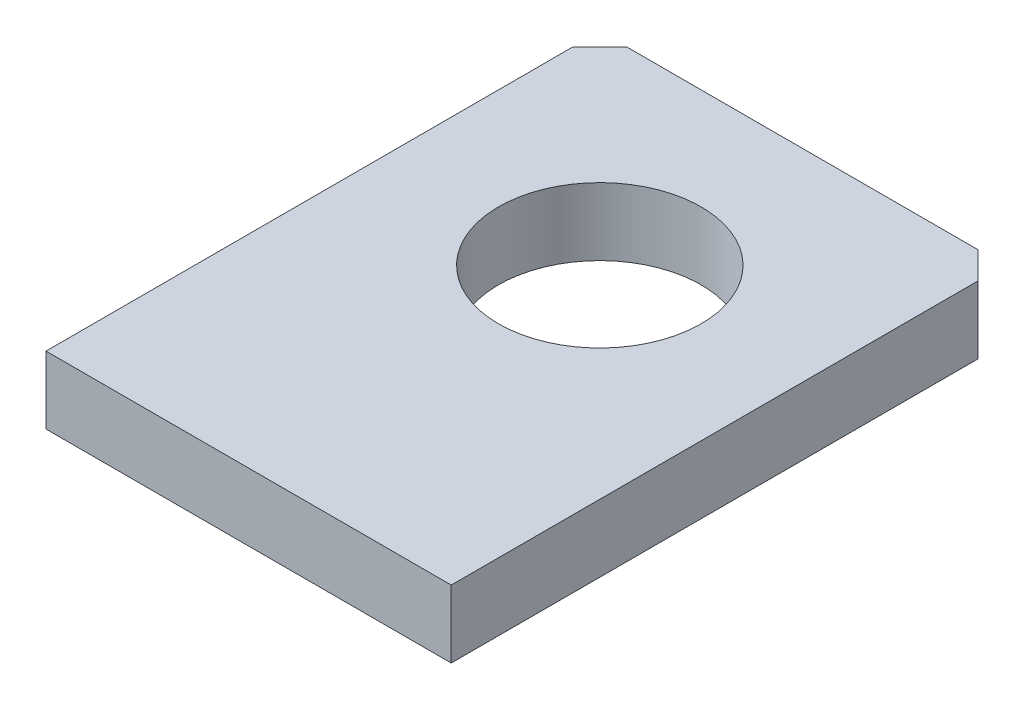
ISO-10303-21;
HEADER;
FILE_DESCRIPTION(('STEP AP214'),'2;1');
FILE_NAME('part.step','',(''),(''),'','','');
FILE_SCHEMA(('AUTOMOTIVE_DESIGN { 1 0 10303 214 1 1 1 1 }'));
ENDSEC;
DATA;
#1=APPLICATION_CONTEXT('core data for automotive mechanical design processes');
#2=APPLICATION_PROTOCOL_DEFINITION('international standard','automotive_design',2000,#1);
#3=PRODUCT_CONTEXT('',#1,'mechanical');
#4=PRODUCT('Part','Part','',(#3));
#5=PRODUCT_RELATED_PRODUCT_CATEGORY('part','',(#4));
#6=PRODUCT_DEFINITION_FORMATION('','',#4);
#7=PRODUCT_DEFINITION_CONTEXT('part definition',#1,'design');
#8=PRODUCT_DEFINITION('design','',#6,#7);
#9=PRODUCT_DEFINITION_SHAPE('','',#8);
#10=(LENGTH_UNIT() NAMED_UNIT(*) SI_UNIT(.MILLI.,.METRE.));
#11=(NAMED_UNIT(*) PLANE_ANGLE_UNIT() SI_UNIT($,.RADIAN.));
#12=(NAMED_UNIT(*) SI_UNIT($,.STERADIAN.) SOLID_ANGLE_UNIT());
#13=UNCERTAINTY_MEASURE_WITH_UNIT(LENGTH_MEASURE(1.E-05),#10,'distance_accuracy_value','');
#14=(GEOMETRIC_REPRESENTATION_CONTEXT(3) GLOBAL_UNCERTAINTY_ASSIGNED_CONTEXT((#13)) GLOBAL_UNIT_ASSIGNED_CONTEXT((#10,
#11,#12)) REPRESENTATION_CONTEXT('',''));
#15=CARTESIAN_POINT('',(0.,0.,0.));
#16=DIRECTION('',(0.,0.,1.));
#17=DIRECTION('',(1.,0.,0.));
#18=AXIS2_PLACEMENT_3D('',#15,#16,#17);
#19=CARTESIAN_POINT('',(-1.5,0.5,2.05));
#20=DIRECTION('',(1.,0.,0.));
#21=DIRECTION('',(0.,0.,-1.));
#22=AXIS2_PLACEMENT_3D('',#19,#20,#21);
#23=PLANE('',#22);
#24=DIRECTION('',(0.,0.,1.));
#25=VECTOR('',#24,1.);
#26=CARTESIAN_POINT('',(-1.5,0.5,2.05));
#27=LINE('',#26,#25);
#28=CARTESIAN_POINT('',(-1.5,0.5,-1.85));
#29=VERTEX_POINT('',#28);
#30=CARTESIAN_POINT('',(-1.5,0.5,2.05));
#31=VERTEX_POINT('',#30);
#32=EDGE_CURVE('E92',#29,#31,#27,.T.);
#33=ORIENTED_EDGE('',*,*,#32,.F.);
#34=DIRECTION('',(0.,-1.,0.));
#35=VECTOR('',#34,1.);
#36=CARTESIAN_POINT('',(-1.5,0.5,-1.85));
#37=LINE('',#36,#35);
#38=CARTESIAN_POINT('',(-1.5,0.,-1.85));
#39=VERTEX_POINT('',#38);
#40=EDGE_CURVE('E11',#29,#39,#37,.T.);
#41=ORIENTED_EDGE('',*,*,#40,.T.);
#42=DIRECTION('',(0.,0.,1.));
#43=VECTOR('',#42,1.);
#44=CARTESIAN_POINT('',(-1.5,0.,2.05));
#45=LINE('',#44,#43);
#46=CARTESIAN_POINT('',(-1.5,0.,2.05));
#47=VERTEX_POINT('',#46);
#48=EDGE_CURVE('E111',#39,#47,#45,.T.);
#49=ORIENTED_EDGE('',*,*,#48,.T.);
#50=DIRECTION('',(0.,-1.,0.));
#51=VECTOR('',#50,1.);
#52=CARTESIAN_POINT('',(-1.5,0.5,2.05));
#53=LINE('',#52,#51);
#54=EDGE_CURVE('E105',#31,#47,#53,.T.);
#55=ORIENTED_EDGE('',*,*,#54,.F.);
#56=EDGE_LOOP('',(#33,#41,#49,#55));
#57=FACE_BOUND('',#56,.T.);
#58=ADVANCED_FACE('F39',(#57),#23,.F.);
#59=CARTESIAN_POINT('',(1.5,0.5,2.05));
#60=DIRECTION('',(0.,0.,-1.));
#61=DIRECTION('',(-1.,0.,0.));
#62=AXIS2_PLACEMENT_3D('',#59,#60,#61);
#63=PLANE('',#62);
#64=DIRECTION('',(1.,0.,0.));
#65=VECTOR('',#64,1.);
#66=CARTESIAN_POINT('',(1.5,0.,2.05));
#67=LINE('',#66,#65);
#68=CARTESIAN_POINT('',(1.5,0.,2.05));
#69=VERTEX_POINT('',#68);
#70=EDGE_CURVE('E144',#47,#69,#67,.T.);
#71=ORIENTED_EDGE('',*,*,#70,.T.);
#72=DIRECTION('',(0.,-1.,0.));
#73=VECTOR('',#72,1.);
#74=CARTESIAN_POINT('',(1.5,0.5,2.05));
#75=LINE('',#74,#73);
#76=CARTESIAN_POINT('',(1.5,0.5,2.05));
#77=VERTEX_POINT('',#76);
#78=EDGE_CURVE('E107',#77,#69,#75,.T.);
#79=ORIENTED_EDGE('',*,*,#78,.F.);
#80=DIRECTION('',(1.,0.,0.));
#81=VECTOR('',#80,1.);
#82=CARTESIAN_POINT('',(1.5,0.5,2.05));
#83=LINE('',#82,#81);
#84=EDGE_CURVE('E95',#31,#77,#83,.T.);
#85=ORIENTED_EDGE('',*,*,#84,.F.);
#86=ORIENTED_EDGE('',*,*,#54,.T.);
#87=EDGE_LOOP('',(#71,#79,#85,#86));
#88=FACE_BOUND('',#87,.T.);
#89=ADVANCED_FACE('F104',(#88),#63,.F.);
#90=CARTESIAN_POINT('',(1.5,0.5,2.05));
#91=DIRECTION('',(-1.,0.,0.));
#92=DIRECTION('',(0.,0.,1.));
#93=AXIS2_PLACEMENT_3D('',#90,#91,#92);
#94=PLANE('',#93);
#95=DIRECTION('',(0.,0.,-1.));
#96=VECTOR('',#95,1.);
#97=CARTESIAN_POINT('',(1.5,0.,2.05));
#98=LINE('',#97,#96);
#99=CARTESIAN_POINT('',(1.5,0.,-1.85));
#100=VERTEX_POINT('',#99);
#101=EDGE_CURVE('E142',#69,#100,#98,.T.);
#102=ORIENTED_EDGE('',*,*,#101,.T.);
#103=DIRECTION('',(0.,1.,0.));
#104=VECTOR('',#103,1.);
#105=CARTESIAN_POINT('',(1.5,0.5,-1.85));
#106=LINE('',#105,#104);
#107=CARTESIAN_POINT('',(1.5,0.5,-1.85));
#108=VERTEX_POINT('',#107);
#109=EDGE_CURVE('E62',#100,#108,#106,.T.);
#110=ORIENTED_EDGE('',*,*,#109,.T.);
#111=DIRECTION('',(0.,0.,-1.));
#112=VECTOR('',#111,1.);
#113=CARTESIAN_POINT('',(1.5,0.5,2.05));
#114=LINE('',#113,#112);
#115=EDGE_CURVE('E108',#77,#108,#114,.T.);
#116=ORIENTED_EDGE('',*,*,#115,.F.);
#117=ORIENTED_EDGE('',*,*,#78,.T.);
#118=EDGE_LOOP('',(#102,#110,#116,#117));
#119=FACE_BOUND('',#118,.T.);
#120=ADVANCED_FACE('F143',(#119),#94,.F.);
#121=CARTESIAN_POINT('',(1.5,0.5,-2.05));
#122=DIRECTION('',(0.,0.,1.));
#123=DIRECTION('',(1.,0.,0.));
#124=AXIS2_PLACEMENT_3D('',#121,#122,#123);
#125=PLANE('',#124);
#126=DIRECTION('',(-1.,0.,0.));
#127=VECTOR('',#126,1.);
#128=CARTESIAN_POINT('',(1.5,0.5,-2.05));
#129=LINE('',#128,#127);
#130=CARTESIAN_POINT('',(1.3,0.5,-2.05));
#131=VERTEX_POINT('',#130);
#132=CARTESIAN_POINT('',(-1.3,0.5,-2.05));
#133=VERTEX_POINT('',#132);
#134=EDGE_CURVE('E117',#131,#133,#129,.T.);
#135=ORIENTED_EDGE('',*,*,#134,.F.);
#136=DIRECTION('',(0.,-1.,0.));
#137=VECTOR('',#136,1.);
#138=CARTESIAN_POINT('',(1.3,0.5,-2.05));
#139=LINE('',#138,#137);
#140=CARTESIAN_POINT('',(1.3,0.,-2.05));
#141=VERTEX_POINT('',#140);
#142=EDGE_CURVE('E115',#131,#141,#139,.T.);
#143=ORIENTED_EDGE('',*,*,#142,.T.);
#144=DIRECTION('',(-1.,0.,0.));
#145=VECTOR('',#144,1.);
#146=CARTESIAN_POINT('',(1.5,0.,-2.05));
#147=LINE('',#146,#145);
#148=CARTESIAN_POINT('',(-1.3,0.,-2.05));
#149=VERTEX_POINT('',#148);
#150=EDGE_CURVE('E100',#141,#149,#147,.T.);
#151=ORIENTED_EDGE('',*,*,#150,.T.);
#152=DIRECTION('',(0.,1.,0.));
#153=VECTOR('',#152,1.);
#154=CARTESIAN_POINT('',(-1.3,0.5,-2.05));
#155=LINE('',#154,#153);
#156=EDGE_CURVE('E113',#149,#133,#155,.T.);
#157=ORIENTED_EDGE('',*,*,#156,.T.);
#158=EDGE_LOOP('',(#135,#143,#151,#157));
#159=FACE_BOUND('',#158,.T.);
#160=ADVANCED_FACE('F133',(#159),#125,.F.);
#161=CARTESIAN_POINT('',(0.,0.5,0.));
#162=DIRECTION('',(0.,1.,0.));
#163=DIRECTION('',(0.,0.,1.));
#164=AXIS2_PLACEMENT_3D('',#161,#162,#163);
#165=PLANE('',#164);
#166=CARTESIAN_POINT('',(0.,0.5,-0.55));
#167=DIRECTION('',(0.,1.,0.));
#168=DIRECTION('',(0.,0.,1.));
#169=AXIS2_PLACEMENT_3D('',#166,#167,#168);
#170=CIRCLE('',#169,0.75);
#171=CARTESIAN_POINT('',(0.,0.5,0.2));
#172=VERTEX_POINT('',#171);
#173=EDGE_CURVE('E151',#172,#172,#170,.T.);
#174=ORIENTED_EDGE('',*,*,#173,.F.);
#175=EDGE_LOOP('',(#174));
#176=FACE_BOUND('',#175,.T.);
#177=ORIENTED_EDGE('',*,*,#115,.T.);
#178=DIRECTION('',(0.707106781186548,0.,0.707106781186548));
#179=VECTOR('',#178,1.);
#180=CARTESIAN_POINT('',(1.675,0.5,-1.675));
#181=LINE('',#180,#179);
#182=EDGE_CURVE('E47',#108,#131,#181,.F.);
#183=ORIENTED_EDGE('',*,*,#182,.T.);
#184=ORIENTED_EDGE('',*,*,#134,.T.);
#185=DIRECTION('',(0.70710678118655,0.,-0.707106781186545));
#186=VECTOR('',#185,1.);
#187=CARTESIAN_POINT('',(-1.675,0.5,-1.67500000000001));
#188=LINE('',#187,#186);
#189=EDGE_CURVE('E54',#133,#29,#188,.F.);
#190=ORIENTED_EDGE('',*,*,#189,.T.);
#191=ORIENTED_EDGE('',*,*,#32,.T.);
#192=ORIENTED_EDGE('',*,*,#84,.T.);
#193=EDGE_LOOP('',(#177,#183,#184,#190,#191,#192));
#194=FACE_BOUND('',#193,.T.);
#195=ADVANCED_FACE('F94',(#176,#194),#165,.T.);
#196=CARTESIAN_POINT('',(0.,0.,0.));
#197=DIRECTION('',(0.,1.,0.));
#198=DIRECTION('',(0.,0.,1.));
#199=AXIS2_PLACEMENT_3D('',#196,#197,#198);
#200=PLANE('',#199);
#201=CARTESIAN_POINT('',(0.,0.,-0.55));
#202=DIRECTION('',(0.,1.,0.));
#203=DIRECTION('',(0.,0.,1.));
#204=AXIS2_PLACEMENT_3D('',#201,#202,#203);
#205=CIRCLE('',#204,0.75);
#206=CARTESIAN_POINT('',(0.,0.,0.2));
#207=VERTEX_POINT('',#206);
#208=EDGE_CURVE('E148',#207,#207,#205,.T.);
#209=ORIENTED_EDGE('',*,*,#208,.T.);
#210=EDGE_LOOP('',(#209));
#211=FACE_BOUND('',#210,.T.);
#212=ORIENTED_EDGE('',*,*,#150,.F.);
#213=DIRECTION('',(-0.707106781186548,0.,-0.707106781186548));
#214=VECTOR('',#213,1.);
#215=CARTESIAN_POINT('',(1.3,0.,-2.05));
#216=LINE('',#215,#214);
#217=EDGE_CURVE('E125',#141,#100,#216,.F.);
#218=ORIENTED_EDGE('',*,*,#217,.T.);
#219=ORIENTED_EDGE('',*,*,#101,.F.);
#220=ORIENTED_EDGE('',*,*,#70,.F.);
#221=ORIENTED_EDGE('',*,*,#48,.F.);
#222=DIRECTION('',(-0.70710678118655,0.,0.707106781186545));
#223=VECTOR('',#222,1.);
#224=CARTESIAN_POINT('',(-1.5,0.,-1.85));
#225=LINE('',#224,#223);
#226=EDGE_CURVE('E123',#39,#149,#225,.F.);
#227=ORIENTED_EDGE('',*,*,#226,.T.);
#228=EDGE_LOOP('',(#212,#218,#219,#220,#221,#227));
#229=FACE_BOUND('',#228,.T.);
#230=ADVANCED_FACE('F141',(#211,#229),#200,.F.);
#231=CARTESIAN_POINT('',(1.3,0.5,-2.05));
#232=DIRECTION('',(-0.707106781186548,0.,0.707106781186548));
#233=DIRECTION('',(0.,-1.,0.));
#234=AXIS2_PLACEMENT_3D('',#231,#232,#233);
#235=PLANE('',#234);
#236=ORIENTED_EDGE('',*,*,#182,.F.);
#237=ORIENTED_EDGE('',*,*,#109,.F.);
#238=ORIENTED_EDGE('',*,*,#217,.F.);
#239=ORIENTED_EDGE('',*,*,#142,.F.);
#240=EDGE_LOOP('',(#236,#237,#238,#239));
#241=FACE_BOUND('',#240,.T.);
#242=ADVANCED_FACE('F138',(#241),#235,.F.);
#243=CARTESIAN_POINT('',(-1.5,0.5,-1.85));
#244=DIRECTION('',(0.707106781186545,0.,0.70710678118655));
#245=DIRECTION('',(0.,-1.,0.));
#246=AXIS2_PLACEMENT_3D('',#243,#244,#245);
#247=PLANE('',#246);
#248=ORIENTED_EDGE('',*,*,#189,.F.);
#249=ORIENTED_EDGE('',*,*,#156,.F.);
#250=ORIENTED_EDGE('',*,*,#226,.F.);
#251=ORIENTED_EDGE('',*,*,#40,.F.);
#252=EDGE_LOOP('',(#248,#249,#250,#251));
#253=FACE_BOUND('',#252,.T.);
#254=ADVANCED_FACE('F41',(#253),#247,.F.);
#255=CARTESIAN_POINT('',(0.,0.,-0.55));
#256=DIRECTION('',(0.,1.,0.));
#257=DIRECTION('',(0.,0.,1.));
#258=AXIS2_PLACEMENT_3D('',#255,#256,#257);
#259=CYLINDRICAL_SURFACE('',#258,0.75);
#260=ORIENTED_EDGE('',*,*,#208,.F.);
#261=EDGE_LOOP('',(#260));
#262=FACE_BOUND('',#261,.T.);
#263=ORIENTED_EDGE('',*,*,#173,.T.);
#264=EDGE_LOOP('',(#263));
#265=FACE_BOUND('',#264,.T.);
#266=ADVANCED_FACE('F158',(#262,#265),#259,.F.);
#267=CLOSED_SHELL('',(#58,#89,#120,#160,#195,#230,#242,#254,#266));
#268=MANIFOLD_SOLID_BREP('B2',#267);
#269=ADVANCED_BREP_SHAPE_REPRESENTATION('',(#18,#268),#14);
#270=SHAPE_DEFINITION_REPRESENTATION(#9,#269);
ENDSEC;
END-ISO-10303-21;
